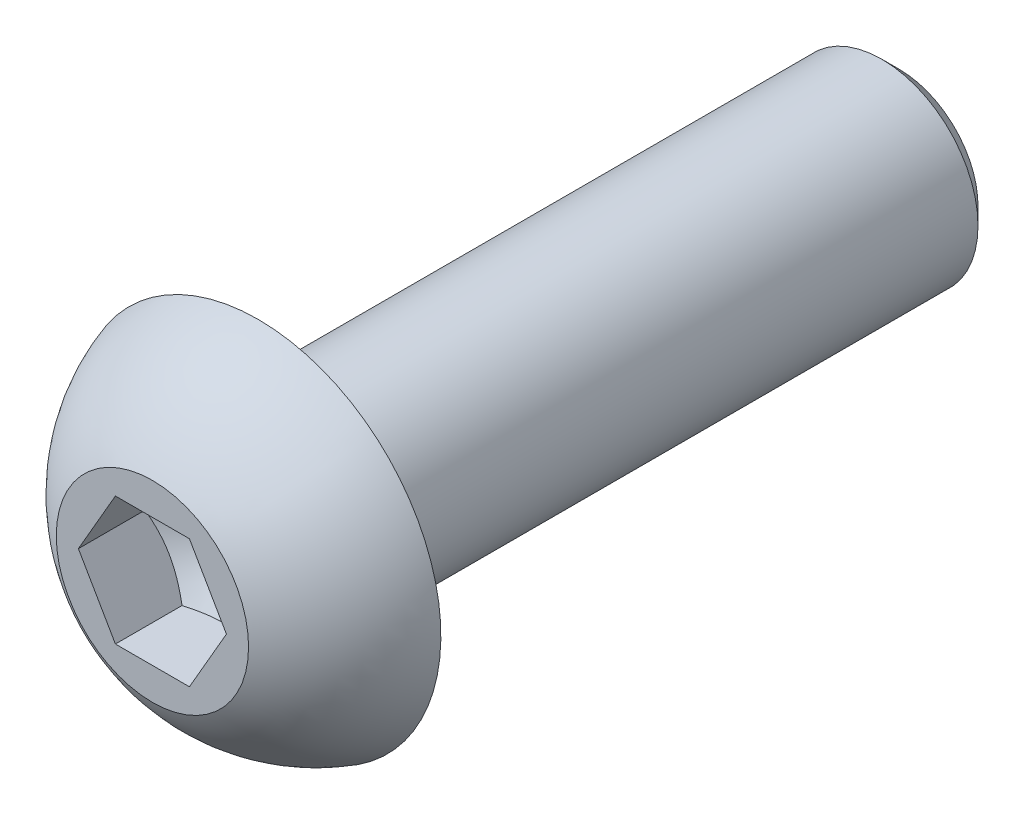
ISO-10303-21;
HEADER;
FILE_DESCRIPTION(('STEP AP214'),'2;1');
FILE_NAME('part.step','',(''),(''),'','','');
FILE_SCHEMA(('AUTOMOTIVE_DESIGN { 1 0 10303 214 1 1 1 1 }'));
ENDSEC;
DATA;
#1=APPLICATION_CONTEXT('core data for automotive mechanical design processes');
#2=APPLICATION_PROTOCOL_DEFINITION('international standard','automotive_design',2000,#1);
#3=PRODUCT_CONTEXT('',#1,'mechanical');
#4=PRODUCT('Part','Part','',(#3));
#5=PRODUCT_RELATED_PRODUCT_CATEGORY('part','',(#4));
#6=PRODUCT_DEFINITION_FORMATION('','',#4);
#7=PRODUCT_DEFINITION_CONTEXT('part definition',#1,'design');
#8=PRODUCT_DEFINITION('design','',#6,#7);
#9=PRODUCT_DEFINITION_SHAPE('','',#8);
#10=(LENGTH_UNIT() NAMED_UNIT(*) SI_UNIT(.MILLI.,.METRE.));
#11=(NAMED_UNIT(*) PLANE_ANGLE_UNIT() SI_UNIT($,.RADIAN.));
#12=(NAMED_UNIT(*) SI_UNIT($,.STERADIAN.) SOLID_ANGLE_UNIT());
#13=UNCERTAINTY_MEASURE_WITH_UNIT(LENGTH_MEASURE(1.E-05),#10,'distance_accuracy_value','');
#14=(GEOMETRIC_REPRESENTATION_CONTEXT(3) GLOBAL_UNCERTAINTY_ASSIGNED_CONTEXT((#13)) GLOBAL_UNIT_ASSIGNED_CONTEXT((#10,
#11,#12)) REPRESENTATION_CONTEXT('',''));
#15=CARTESIAN_POINT('',(0.,0.,0.));
#16=DIRECTION('',(0.,0.,1.));
#17=DIRECTION('',(1.,0.,0.));
#18=AXIS2_PLACEMENT_3D('',#15,#16,#17);
#19=CARTESIAN_POINT('',(0.,0.6146875,-10.));
#20=DIRECTION('',(0.,0.,-1.));
#21=DIRECTION('',(0.,1.,0.));
#22=AXIS2_PLACEMENT_3D('',#19,#20,#21);
#23=PLANE('',#22);
#24=CARTESIAN_POINT('',(0.,0.,-10.));
#25=DIRECTION('',(0.,0.,-1.));
#26=DIRECTION('',(0.,1.,0.));
#27=AXIS2_PLACEMENT_3D('',#24,#25,#26);
#28=CIRCLE('',#27,1.229375);
#29=CARTESIAN_POINT('',(0.,1.229375,-10.));
#30=VERTEX_POINT('',#29);
#31=EDGE_CURVE('E11',#30,#30,#28,.T.);
#32=ORIENTED_EDGE('',*,*,#31,.T.);
#33=EDGE_LOOP('',(#32));
#34=FACE_BOUND('',#33,.T.);
#35=ADVANCED_FACE('F16',(#34),#23,.T.);
#36=CARTESIAN_POINT('',(0.,0.,-9.8646875));
#37=DIRECTION('',(0.,0.,1.));
#38=DIRECTION('',(0.,1.,0.));
#39=AXIS2_PLACEMENT_3D('',#36,#37,#38);
#40=CONICAL_SURFACE('',#39,1.3646875,0.785398163397448);
#41=CARTESIAN_POINT('',(0.,0.,-9.729375));
#42=DIRECTION('',(0.,0.,-1.));
#43=DIRECTION('',(0.,1.,0.));
#44=AXIS2_PLACEMENT_3D('',#41,#42,#43);
#45=CIRCLE('',#44,1.5);
#46=CARTESIAN_POINT('',(0.,1.5,-9.729375));
#47=VERTEX_POINT('',#46);
#48=EDGE_CURVE('E26',#47,#47,#45,.T.);
#49=ORIENTED_EDGE('',*,*,#48,.T.);
#50=EDGE_LOOP('',(#49));
#51=FACE_BOUND('',#50,.T.);
#52=ORIENTED_EDGE('',*,*,#31,.F.);
#53=EDGE_LOOP('',(#52));
#54=FACE_BOUND('',#53,.T.);
#55=ADVANCED_FACE('F170',(#51,#54),#40,.T.);
#56=CARTESIAN_POINT('',(0.,0.,-4.8646875));
#57=DIRECTION('',(0.,0.,1.));
#58=DIRECTION('',(0.,1.,0.));
#59=AXIS2_PLACEMENT_3D('',#56,#57,#58);
#60=CYLINDRICAL_SURFACE('',#59,1.5);
#61=CARTESIAN_POINT('',(0.,0.,0.));
#62=DIRECTION('',(0.,0.,-1.));
#63=DIRECTION('',(0.,1.,0.));
#64=AXIS2_PLACEMENT_3D('',#61,#62,#63);
#65=CIRCLE('',#64,1.5);
#66=CARTESIAN_POINT('',(0.,1.5,0.));
#67=VERTEX_POINT('',#66);
#68=EDGE_CURVE('E114',#67,#67,#65,.T.);
#69=ORIENTED_EDGE('',*,*,#68,.T.);
#70=EDGE_LOOP('',(#69));
#71=FACE_BOUND('',#70,.T.);
#72=ORIENTED_EDGE('',*,*,#48,.F.);
#73=EDGE_LOOP('',(#72));
#74=FACE_BOUND('',#73,.T.);
#75=ADVANCED_FACE('F173',(#71,#74),#60,.T.);
#76=CARTESIAN_POINT('',(0.,2.175,0.));
#77=DIRECTION('',(0.,0.,-1.));
#78=DIRECTION('',(0.,1.,0.));
#79=AXIS2_PLACEMENT_3D('',#76,#77,#78);
#80=PLANE('',#79);
#81=CARTESIAN_POINT('',(0.,0.,0.));
#82=DIRECTION('',(0.,0.,-1.));
#83=DIRECTION('',(0.,1.,0.));
#84=AXIS2_PLACEMENT_3D('',#81,#82,#83);
#85=CIRCLE('',#84,2.85);
#86=CARTESIAN_POINT('',(0.,2.85,0.));
#87=VERTEX_POINT('',#86);
#88=EDGE_CURVE('E116',#87,#87,#85,.T.);
#89=ORIENTED_EDGE('',*,*,#88,.T.);
#90=EDGE_LOOP('',(#89));
#91=FACE_BOUND('',#90,.T.);
#92=ORIENTED_EDGE('',*,*,#68,.F.);
#93=EDGE_LOOP('',(#92));
#94=FACE_BOUND('',#93,.T.);
#95=ADVANCED_FACE('F175',(#91,#94),#80,.T.);
#96=CARTESIAN_POINT('',(0.,0.,-0.848743432909574));
#97=DIRECTION('',(0.,0.,-1.));
#98=DIRECTION('',(-1.,0.,0.));
#99=AXIS2_PLACEMENT_3D('',#96,#97,#98);
#100=DEGENERATE_TOROIDAL_SURFACE('',#99,0.129313581999411,2.85,.T.);
#101=CARTESIAN_POINT('',(0.,0.,1.65));
#102=DIRECTION('',(0.,0.,-1.));
#103=DIRECTION('',(0.,1.,0.));
#104=AXIS2_PLACEMENT_3D('',#101,#102,#103);
#105=CIRCLE('',#104,1.5);
#106=CARTESIAN_POINT('',(0.,1.5,1.65));
#107=VERTEX_POINT('',#106);
#108=EDGE_CURVE('E94',#107,#107,#105,.T.);
#109=ORIENTED_EDGE('',*,*,#108,.T.);
#110=EDGE_LOOP('',(#109));
#111=FACE_BOUND('',#110,.T.);
#112=ORIENTED_EDGE('',*,*,#88,.F.);
#113=EDGE_LOOP('',(#112));
#114=FACE_BOUND('',#113,.T.);
#115=ADVANCED_FACE('F183',(#111,#114),#100,.T.);
#116=CARTESIAN_POINT('',(0.,0.75,1.65));
#117=DIRECTION('',(0.,0.,1.));
#118=DIRECTION('',(0.,-1.,0.));
#119=AXIS2_PLACEMENT_3D('',#116,#117,#118);
#120=PLANE('',#119);
#121=ORIENTED_EDGE('',*,*,#108,.F.);
#122=EDGE_LOOP('',(#121));
#123=FACE_BOUND('',#122,.T.);
#124=DIRECTION('',(-0.5,0.866025403784439,0.));
#125=VECTOR('',#124,1.);
#126=CARTESIAN_POINT('',(-1.02840476320958,-0.218749766874945,1.65));
#127=LINE('',#126,#125);
#128=CARTESIAN_POINT('',(-0.57735,-0.999999533749891,1.65));
#129=VERTEX_POINT('',#128);
#130=CARTESIAN_POINT('',(-1.1547,0.,1.65));
#131=VERTEX_POINT('',#130);
#132=EDGE_CURVE('E96',#129,#131,#127,.T.);
#133=ORIENTED_EDGE('',*,*,#132,.T.);
#134=DIRECTION('',(0.5,0.866025403784439,0.));
#135=VECTOR('',#134,1.);
#136=CARTESIAN_POINT('',(-0.703645236790418,0.781249766874945,1.65));
#137=LINE('',#136,#135);
#138=CARTESIAN_POINT('',(-0.57735,0.999999533749891,1.65));
#139=VERTEX_POINT('',#138);
#140=EDGE_CURVE('E87',#131,#139,#137,.T.);
#141=ORIENTED_EDGE('',*,*,#140,.T.);
#142=DIRECTION('',(1.,0.,0.));
#143=VECTOR('',#142,1.);
#144=CARTESIAN_POINT('',(0.,0.999999533749891,1.65));
#145=LINE('',#144,#143);
#146=CARTESIAN_POINT('',(0.57735,0.999999533749891,1.65));
#147=VERTEX_POINT('',#146);
#148=EDGE_CURVE('E162',#139,#147,#145,.T.);
#149=ORIENTED_EDGE('',*,*,#148,.T.);
#150=DIRECTION('',(0.5,-0.866025403784439,0.));
#151=VECTOR('',#150,1.);
#152=CARTESIAN_POINT('',(0.703645236790418,0.781249766874946,1.65));
#153=LINE('',#152,#151);
#154=CARTESIAN_POINT('',(1.1547,0.,1.65));
#155=VERTEX_POINT('',#154);
#156=EDGE_CURVE('E117',#147,#155,#153,.T.);
#157=ORIENTED_EDGE('',*,*,#156,.T.);
#158=DIRECTION('',(-0.5,-0.866025403784439,0.));
#159=VECTOR('',#158,1.);
#160=CARTESIAN_POINT('',(1.02840476320958,-0.218749766874946,1.65));
#161=LINE('',#160,#159);
#162=CARTESIAN_POINT('',(0.57735,-0.999999533749891,1.65));
#163=VERTEX_POINT('',#162);
#164=EDGE_CURVE('E141',#155,#163,#161,.T.);
#165=ORIENTED_EDGE('',*,*,#164,.T.);
#166=DIRECTION('',(-1.,0.,0.));
#167=VECTOR('',#166,1.);
#168=CARTESIAN_POINT('',(0.,-0.999999533749891,1.65));
#169=LINE('',#168,#167);
#170=EDGE_CURVE('E99',#163,#129,#169,.T.);
#171=ORIENTED_EDGE('',*,*,#170,.T.);
#172=EDGE_LOOP('',(#133,#141,#149,#157,#165,#171));
#173=FACE_BOUND('',#172,.T.);
#174=ADVANCED_FACE('F97',(#123,#173),#120,.T.);
#175=CARTESIAN_POINT('',(-0.866025,0.499999766874945,1.65));
#176=DIRECTION('',(-0.866025403784439,0.5,0.));
#177=DIRECTION('',(0.5,0.866025403784439,0.));
#178=AXIS2_PLACEMENT_3D('',#175,#176,#177);
#179=PLANE('',#178);
#180=CARTESIAN_POINT('',(-1.1547,0.,0.61));
#181=CARTESIAN_POINT('',(-0.866025,0.499999766874946,0.443333411041685));
#182=CARTESIAN_POINT('',(-0.57735,0.999999533749891,0.61));
#183=(BOUNDED_CURVE() B_SPLINE_CURVE(2,(#180,#181,#182),.UNSPECIFIED.,.F.,
.F.) B_SPLINE_CURVE_WITH_KNOTS((3,3),(0.,1.16843559329444),
.UNSPECIFIED.) CURVE() GEOMETRIC_REPRESENTATION_ITEM() RATIONAL_B_SPLINE_CURVE((1.,
1.15470053837925,1.)) REPRESENTATION_ITEM(''));
#184=CARTESIAN_POINT('',(-1.1547,0.,0.61));
#185=VERTEX_POINT('',#184);
#186=CARTESIAN_POINT('',(-0.57735,0.999999533749891,0.61));
#187=VERTEX_POINT('',#186);
#188=EDGE_CURVE('E124',#185,#187,#183,.T.);
#189=ORIENTED_EDGE('',*,*,#188,.T.);
#190=DIRECTION('',(0.,0.,-1.));
#191=VECTOR('',#190,1.);
#192=CARTESIAN_POINT('',(-0.57735,0.999999533749891,1.65));
#193=LINE('',#192,#191);
#194=EDGE_CURVE('E90',#139,#187,#193,.T.);
#195=ORIENTED_EDGE('',*,*,#194,.F.);
#196=ORIENTED_EDGE('',*,*,#140,.F.);
#197=DIRECTION('',(0.,0.,-1.));
#198=VECTOR('',#197,1.);
#199=CARTESIAN_POINT('',(-1.1547,0.,1.65));
#200=LINE('',#199,#198);
#201=EDGE_CURVE('E72',#131,#185,#200,.T.);
#202=ORIENTED_EDGE('',*,*,#201,.T.);
#203=EDGE_LOOP('',(#189,#195,#196,#202));
#204=FACE_BOUND('',#203,.T.);
#205=ADVANCED_FACE('F89',(#204),#179,.F.);
#206=CARTESIAN_POINT('',(0.,0.999999533749891,1.65));
#207=DIRECTION('',(0.,1.,0.));
#208=DIRECTION('',(1.,0.,0.));
#209=AXIS2_PLACEMENT_3D('',#206,#207,#208);
#210=PLANE('',#209);
#211=CARTESIAN_POINT('',(-0.57735,0.999999533749891,0.61));
#212=CARTESIAN_POINT('',(0.,0.999999533749893,0.443333411041685));
#213=CARTESIAN_POINT('',(0.57735,0.999999533749891,0.61));
#214=(BOUNDED_CURVE() B_SPLINE_CURVE(2,(#211,#212,#213),.UNSPECIFIED.,.F.,
.F.) B_SPLINE_CURVE_WITH_KNOTS((3,3),(0.,1.16843559329444),
.UNSPECIFIED.) CURVE() GEOMETRIC_REPRESENTATION_ITEM() RATIONAL_B_SPLINE_CURVE((1.,
1.15470053837925,1.)) REPRESENTATION_ITEM(''));
#215=CARTESIAN_POINT('',(0.57735,0.999999533749891,0.61));
#216=VERTEX_POINT('',#215);
#217=EDGE_CURVE('E119',#187,#216,#214,.T.);
#218=ORIENTED_EDGE('',*,*,#217,.T.);
#219=DIRECTION('',(0.,0.,-1.));
#220=VECTOR('',#219,1.);
#221=CARTESIAN_POINT('',(0.57735,0.999999533749891,1.65));
#222=LINE('',#221,#220);
#223=EDGE_CURVE('E20',#147,#216,#222,.T.);
#224=ORIENTED_EDGE('',*,*,#223,.F.);
#225=ORIENTED_EDGE('',*,*,#148,.F.);
#226=ORIENTED_EDGE('',*,*,#194,.T.);
#227=EDGE_LOOP('',(#218,#224,#225,#226));
#228=FACE_BOUND('',#227,.T.);
#229=ADVANCED_FACE('F197',(#228),#210,.F.);
#230=CARTESIAN_POINT('',(0.866025,0.499999766874946,1.65));
#231=DIRECTION('',(0.866025403784439,0.5,0.));
#232=DIRECTION('',(0.5,-0.866025403784439,0.));
#233=AXIS2_PLACEMENT_3D('',#230,#231,#232);
#234=PLANE('',#233);
#235=CARTESIAN_POINT('',(0.57735,0.999999533749891,0.61));
#236=CARTESIAN_POINT('',(0.866025,0.499999766874946,0.443333411041685));
#237=CARTESIAN_POINT('',(1.1547,0.,0.61));
#238=(BOUNDED_CURVE() B_SPLINE_CURVE(2,(#235,#236,#237),.UNSPECIFIED.,.F.,
.F.) B_SPLINE_CURVE_WITH_KNOTS((3,3),(0.,1.16843559329444),
.UNSPECIFIED.) CURVE() GEOMETRIC_REPRESENTATION_ITEM() RATIONAL_B_SPLINE_CURVE((1.,
1.15470053837925,1.)) REPRESENTATION_ITEM(''));
#239=CARTESIAN_POINT('',(1.1547,0.,0.61));
#240=VERTEX_POINT('',#239);
#241=EDGE_CURVE('E125',#216,#240,#238,.T.);
#242=ORIENTED_EDGE('',*,*,#241,.T.);
#243=DIRECTION('',(0.,0.,-1.));
#244=VECTOR('',#243,1.);
#245=CARTESIAN_POINT('',(1.1547,0.,1.65));
#246=LINE('',#245,#244);
#247=EDGE_CURVE('E112',#155,#240,#246,.T.);
#248=ORIENTED_EDGE('',*,*,#247,.F.);
#249=ORIENTED_EDGE('',*,*,#156,.F.);
#250=ORIENTED_EDGE('',*,*,#223,.T.);
#251=EDGE_LOOP('',(#242,#248,#249,#250));
#252=FACE_BOUND('',#251,.T.);
#253=ADVANCED_FACE('F193',(#252),#234,.F.);
#254=CARTESIAN_POINT('',(0.866025,-0.499999766874946,1.65));
#255=DIRECTION('',(0.866025403784439,-0.5,0.));
#256=DIRECTION('',(-0.5,-0.866025403784439,0.));
#257=AXIS2_PLACEMENT_3D('',#254,#255,#256);
#258=PLANE('',#257);
#259=CARTESIAN_POINT('',(1.1547,0.,0.61));
#260=CARTESIAN_POINT('',(0.866025,-0.499999766874945,0.443333411041685));
#261=CARTESIAN_POINT('',(0.57735,-0.999999533749891,0.61));
#262=(BOUNDED_CURVE() B_SPLINE_CURVE(2,(#259,#260,#261),.UNSPECIFIED.,.F.,
.F.) B_SPLINE_CURVE_WITH_KNOTS((3,3),(0.,1.16843559329444),
.UNSPECIFIED.) CURVE() GEOMETRIC_REPRESENTATION_ITEM() RATIONAL_B_SPLINE_CURVE((1.,
1.15470053837925,1.)) REPRESENTATION_ITEM(''));
#263=CARTESIAN_POINT('',(0.57735,-0.999999533749891,0.61));
#264=VERTEX_POINT('',#263);
#265=EDGE_CURVE('E105',#240,#264,#262,.T.);
#266=ORIENTED_EDGE('',*,*,#265,.T.);
#267=DIRECTION('',(0.,0.,-1.));
#268=VECTOR('',#267,1.);
#269=CARTESIAN_POINT('',(0.57735,-0.999999533749891,1.65));
#270=LINE('',#269,#268);
#271=EDGE_CURVE('E143',#163,#264,#270,.T.);
#272=ORIENTED_EDGE('',*,*,#271,.F.);
#273=ORIENTED_EDGE('',*,*,#164,.F.);
#274=ORIENTED_EDGE('',*,*,#247,.T.);
#275=EDGE_LOOP('',(#266,#272,#273,#274));
#276=FACE_BOUND('',#275,.T.);
#277=ADVANCED_FACE('F196',(#276),#258,.F.);
#278=CARTESIAN_POINT('',(0.,-0.999999533749891,1.65));
#279=DIRECTION('',(0.,-1.,0.));
#280=DIRECTION('',(-1.,0.,0.));
#281=AXIS2_PLACEMENT_3D('',#278,#279,#280);
#282=PLANE('',#281);
#283=CARTESIAN_POINT('',(0.57735,-0.999999533749891,0.61));
#284=CARTESIAN_POINT('',(0.,-0.999999533749893,0.443333411041685));
#285=CARTESIAN_POINT('',(-0.57735,-0.999999533749891,0.61));
#286=(BOUNDED_CURVE() B_SPLINE_CURVE(2,(#283,#284,#285),.UNSPECIFIED.,.F.,
.F.) B_SPLINE_CURVE_WITH_KNOTS((3,3),(0.,1.16843559329444),
.UNSPECIFIED.) CURVE() GEOMETRIC_REPRESENTATION_ITEM() RATIONAL_B_SPLINE_CURVE((1.,
1.15470053837925,1.)) REPRESENTATION_ITEM(''));
#287=CARTESIAN_POINT('',(-0.57735,-0.999999533749892,0.61));
#288=VERTEX_POINT('',#287);
#289=EDGE_CURVE('E108',#264,#288,#286,.T.);
#290=ORIENTED_EDGE('',*,*,#289,.T.);
#291=DIRECTION('',(0.,0.,-1.));
#292=VECTOR('',#291,1.);
#293=CARTESIAN_POINT('',(-0.57735,-0.999999533749891,1.65));
#294=LINE('',#293,#292);
#295=EDGE_CURVE('E61',#129,#288,#294,.T.);
#296=ORIENTED_EDGE('',*,*,#295,.F.);
#297=ORIENTED_EDGE('',*,*,#170,.F.);
#298=ORIENTED_EDGE('',*,*,#271,.T.);
#299=EDGE_LOOP('',(#290,#296,#297,#298));
#300=FACE_BOUND('',#299,.T.);
#301=ADVANCED_FACE('F203',(#300),#282,.F.);
#302=CARTESIAN_POINT('',(-0.866025,-0.499999766874946,1.65));
#303=DIRECTION('',(-0.866025403784439,-0.5,0.));
#304=DIRECTION('',(-0.5,0.866025403784439,0.));
#305=AXIS2_PLACEMENT_3D('',#302,#303,#304);
#306=PLANE('',#305);
#307=CARTESIAN_POINT('',(-0.57735,-0.999999533749891,0.61));
#308=CARTESIAN_POINT('',(-0.866025,-0.499999766874945,0.443333411041685));
#309=CARTESIAN_POINT('',(-1.1547,0.,0.61));
#310=(BOUNDED_CURVE() B_SPLINE_CURVE(2,(#307,#308,#309),.UNSPECIFIED.,.F.,
.F.) B_SPLINE_CURVE_WITH_KNOTS((3,3),(0.,1.16843559329444),
.UNSPECIFIED.) CURVE() GEOMETRIC_REPRESENTATION_ITEM() RATIONAL_B_SPLINE_CURVE((1.,
1.15470053837925,1.)) REPRESENTATION_ITEM(''));
#311=EDGE_CURVE('E103',#288,#185,#310,.T.);
#312=ORIENTED_EDGE('',*,*,#311,.T.);
#313=ORIENTED_EDGE('',*,*,#201,.F.);
#314=ORIENTED_EDGE('',*,*,#132,.F.);
#315=ORIENTED_EDGE('',*,*,#295,.T.);
#316=EDGE_LOOP('',(#312,#313,#314,#315));
#317=FACE_BOUND('',#316,.T.);
#318=ADVANCED_FACE('F101',(#317),#306,.F.);
#319=CARTESIAN_POINT('',(0.,0.,0.27666682208337));
#320=DIRECTION('',(0.,0.,1.));
#321=DIRECTION('',(0.,1.,0.));
#322=AXIS2_PLACEMENT_3D('',#319,#320,#321);
#323=CONICAL_SURFACE('',#322,0.57735,1.0471975511966);
#324=CARTESIAN_POINT('',(0.,0.,-0.056666355833261));
#325=VERTEX_POINT('',#324);
#326=VERTEX_LOOP('',#325);
#327=FACE_BOUND('',#326,.T.);
#328=ORIENTED_EDGE('',*,*,#241,.F.);
#329=ORIENTED_EDGE('',*,*,#217,.F.);
#330=ORIENTED_EDGE('',*,*,#188,.F.);
#331=ORIENTED_EDGE('',*,*,#311,.F.);
#332=ORIENTED_EDGE('',*,*,#289,.F.);
#333=ORIENTED_EDGE('',*,*,#265,.F.);
#334=EDGE_LOOP('',(#328,#329,#330,#331,#332,#333));
#335=FACE_BOUND('',#334,.T.);
#336=ADVANCED_FACE('F18',(#327,#335),#323,.F.);
#337=CLOSED_SHELL('',(#35,#55,#75,#95,#115,#174,#205,#229,#253,#277,#301,#318,#336));
#338=MANIFOLD_SOLID_BREP('B1',#337);
#339=ADVANCED_BREP_SHAPE_REPRESENTATION('',(#18,#338),#14);
#340=SHAPE_DEFINITION_REPRESENTATION(#9,#339);
ENDSEC;
END-ISO-10303-21;
